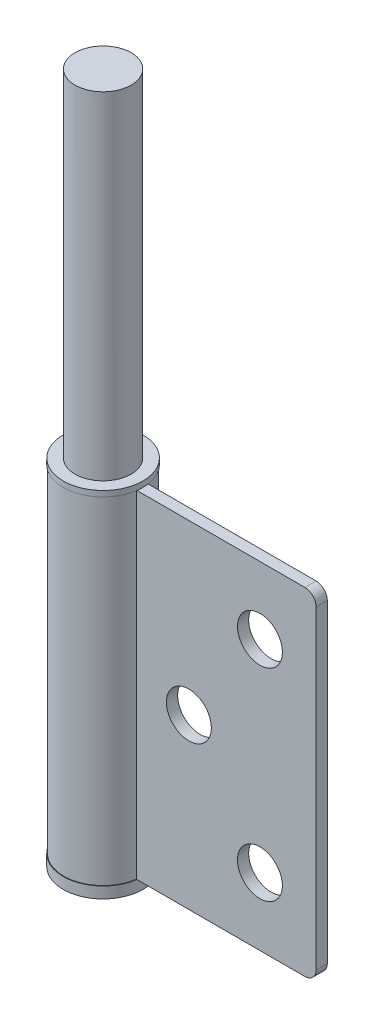
ISO-10303-21;
HEADER;
FILE_DESCRIPTION(('STEP AP214'),'2;1');
FILE_NAME('part.step','',(''),(''),'','','');
FILE_SCHEMA(('AUTOMOTIVE_DESIGN { 1 0 10303 214 1 1 1 1 }'));
ENDSEC;
DATA;
#1=APPLICATION_CONTEXT('core data for automotive mechanical design processes');
#2=APPLICATION_PROTOCOL_DEFINITION('international standard','automotive_design',2000,#1);
#3=PRODUCT_CONTEXT('',#1,'mechanical');
#4=PRODUCT('Part','Part','',(#3));
#5=PRODUCT_RELATED_PRODUCT_CATEGORY('part','',(#4));
#6=PRODUCT_DEFINITION_FORMATION('','',#4);
#7=PRODUCT_DEFINITION_CONTEXT('part definition',#1,'design');
#8=PRODUCT_DEFINITION('design','',#6,#7);
#9=PRODUCT_DEFINITION_SHAPE('','',#8);
#10=(LENGTH_UNIT() NAMED_UNIT(*) SI_UNIT(.MILLI.,.METRE.));
#11=(NAMED_UNIT(*) PLANE_ANGLE_UNIT() SI_UNIT($,.RADIAN.));
#12=(NAMED_UNIT(*) SI_UNIT($,.STERADIAN.) SOLID_ANGLE_UNIT());
#13=UNCERTAINTY_MEASURE_WITH_UNIT(LENGTH_MEASURE(1.E-05),#10,'distance_accuracy_value','');
#14=(GEOMETRIC_REPRESENTATION_CONTEXT(3) GLOBAL_UNCERTAINTY_ASSIGNED_CONTEXT((#13)) GLOBAL_UNIT_ASSIGNED_CONTEXT((#10,
#11,#12)) REPRESENTATION_CONTEXT('',''));
#15=CARTESIAN_POINT('',(0.,0.,0.));
#16=DIRECTION('',(0.,0.,1.));
#17=DIRECTION('',(1.,0.,0.));
#18=AXIS2_PLACEMENT_3D('',#15,#16,#17);
#19=CARTESIAN_POINT('',(0.,30.,0.));
#20=DIRECTION('',(0.,1.,0.));
#21=DIRECTION('',(0.,0.,1.));
#22=AXIS2_PLACEMENT_3D('',#19,#20,#21);
#23=PLANE('',#22);
#24=DIRECTION('',(-1.,0.,0.));
#25=VECTOR('',#24,1.);
#26=CARTESIAN_POINT('',(19.4641016151378,30.,-0.500000000000001));
#27=LINE('',#26,#25);
#28=CARTESIAN_POINT('',(18.4641016151378,30.,-0.500000000000001));
#29=VERTEX_POINT('',#28);
#30=CARTESIAN_POINT('',(3.514612354158,30.,-0.499999999999999));
#31=VERTEX_POINT('',#30);
#32=EDGE_CURVE('E119',#29,#31,#27,.T.);
#33=ORIENTED_EDGE('',*,*,#32,.T.);
#34=CARTESIAN_POINT('',(0.,30.,0.));
#35=DIRECTION('',(0.,1.,0.));
#36=DIRECTION('',(0.,0.,1.));
#37=AXIS2_PLACEMENT_3D('',#34,#35,#36);
#38=CIRCLE('',#37,3.55);
#39=CARTESIAN_POINT('',(3.514612354158,30.,0.500000000000001));
#40=VERTEX_POINT('',#39);
#41=EDGE_CURVE('E50',#40,#31,#38,.T.);
#42=ORIENTED_EDGE('',*,*,#41,.F.);
#43=DIRECTION('',(1.,0.,0.));
#44=VECTOR('',#43,1.);
#45=CARTESIAN_POINT('',(19.4641016151378,30.,0.499999999999999));
#46=LINE('',#45,#44);
#47=CARTESIAN_POINT('',(18.4641016151378,30.,0.499999999999999));
#48=VERTEX_POINT('',#47);
#49=EDGE_CURVE('E111',#40,#48,#46,.T.);
#50=ORIENTED_EDGE('',*,*,#49,.T.);
#51=DIRECTION('',(0.,0.,-1.));
#52=VECTOR('',#51,1.);
#53=CARTESIAN_POINT('',(18.4641016151378,30.,-0.500000000000001));
#54=LINE('',#53,#52);
#55=EDGE_CURVE('E176',#48,#29,#54,.T.);
#56=ORIENTED_EDGE('',*,*,#55,.T.);
#57=EDGE_LOOP('',(#33,#42,#50,#56));
#58=FACE_BOUND('',#57,.T.);
#59=ADVANCED_FACE('F35',(#58),#23,.T.);
#60=CARTESIAN_POINT('',(0.,0.,0.));
#61=DIRECTION('',(0.,1.,0.));
#62=DIRECTION('',(0.,0.,1.));
#63=AXIS2_PLACEMENT_3D('',#60,#61,#62);
#64=PLANE('',#63);
#65=CARTESIAN_POINT('',(0.,0.,0.));
#66=DIRECTION('',(0.,-1.,0.));
#67=DIRECTION('',(0.,0.,-1.));
#68=AXIS2_PLACEMENT_3D('',#65,#66,#67);
#69=CIRCLE('',#68,3.55);
#70=CARTESIAN_POINT('',(3.51461235415799,0.,-0.499999999999999));
#71=VERTEX_POINT('',#70);
#72=CARTESIAN_POINT('',(3.51461235415799,0.,0.500000000000001));
#73=VERTEX_POINT('',#72);
#74=EDGE_CURVE('E129',#71,#73,#69,.T.);
#75=ORIENTED_EDGE('',*,*,#74,.F.);
#76=DIRECTION('',(-1.,0.,0.));
#77=VECTOR('',#76,1.);
#78=CARTESIAN_POINT('',(19.4641016151378,0.,-0.500000000000001));
#79=LINE('',#78,#77);
#80=CARTESIAN_POINT('',(18.4641016151378,0.,-0.500000000000001));
#81=VERTEX_POINT('',#80);
#82=EDGE_CURVE('E112',#81,#71,#79,.T.);
#83=ORIENTED_EDGE('',*,*,#82,.F.);
#84=DIRECTION('',(0.,0.,-1.));
#85=VECTOR('',#84,1.);
#86=CARTESIAN_POINT('',(18.4641016151378,0.,0.));
#87=LINE('',#86,#85);
#88=CARTESIAN_POINT('',(18.4641016151378,0.,0.499999999999999));
#89=VERTEX_POINT('',#88);
#90=EDGE_CURVE('E43',#81,#89,#87,.F.);
#91=ORIENTED_EDGE('',*,*,#90,.T.);
#92=DIRECTION('',(1.,0.,0.));
#93=VECTOR('',#92,1.);
#94=CARTESIAN_POINT('',(19.4641016151378,0.,0.499999999999999));
#95=LINE('',#94,#93);
#96=EDGE_CURVE('E165',#73,#89,#95,.T.);
#97=ORIENTED_EDGE('',*,*,#96,.F.);
#98=EDGE_LOOP('',(#75,#83,#91,#97));
#99=FACE_BOUND('',#98,.T.);
#100=ADVANCED_FACE('F199',(#99),#64,.F.);
#101=CARTESIAN_POINT('',(0.,30.,0.));
#102=DIRECTION('',(0.,-1.,0.));
#103=DIRECTION('',(0.,0.,-1.));
#104=AXIS2_PLACEMENT_3D('',#101,#102,#103);
#105=CYLINDRICAL_SURFACE('',#104,3.5);
#106=CARTESIAN_POINT('',(0.,0.,0.));
#107=DIRECTION('',(0.,1.,0.));
#108=DIRECTION('',(0.,0.,1.));
#109=AXIS2_PLACEMENT_3D('',#106,#107,#108);
#110=CIRCLE('',#109,3.5);
#111=CARTESIAN_POINT('',(3.46410161513775,0.,-0.499999999999999));
#112=VERTEX_POINT('',#111);
#113=CARTESIAN_POINT('',(3.46410161513776,0.,0.500000000000001));
#114=VERTEX_POINT('',#113);
#115=EDGE_CURVE('E150',#112,#114,#110,.T.);
#116=ORIENTED_EDGE('',*,*,#115,.T.);
#117=DIRECTION('',(0.,-1.,0.));
#118=VECTOR('',#117,1.);
#119=CARTESIAN_POINT('',(3.46410161513776,30.,0.500000000000001));
#120=LINE('',#119,#118);
#121=CARTESIAN_POINT('',(3.46410161513776,30.,0.500000000000001));
#122=VERTEX_POINT('',#121);
#123=EDGE_CURVE('E108',#122,#114,#120,.T.);
#124=ORIENTED_EDGE('',*,*,#123,.F.);
#125=CARTESIAN_POINT('',(0.,30.,0.));
#126=DIRECTION('',(0.,1.,0.));
#127=DIRECTION('',(0.,0.,1.));
#128=AXIS2_PLACEMENT_3D('',#125,#126,#127);
#129=CIRCLE('',#128,3.5);
#130=CARTESIAN_POINT('',(3.46410161513776,30.,-0.499999999999999));
#131=VERTEX_POINT('',#130);
#132=EDGE_CURVE('E103',#131,#122,#129,.T.);
#133=ORIENTED_EDGE('',*,*,#132,.F.);
#134=DIRECTION('',(0.,-1.,0.));
#135=VECTOR('',#134,1.);
#136=CARTESIAN_POINT('',(3.46410161513775,30.,-0.499999999999999));
#137=LINE('',#136,#135);
#138=EDGE_CURVE('E106',#131,#112,#137,.T.);
#139=ORIENTED_EDGE('',*,*,#138,.T.);
#140=EDGE_LOOP('',(#116,#124,#133,#139));
#141=FACE_BOUND('',#140,.T.);
#142=ADVANCED_FACE('F105',(#141),#105,.T.);
#143=CARTESIAN_POINT('',(19.4641016151378,30.,0.499999999999999));
#144=DIRECTION('',(0.,0.,-1.));
#145=DIRECTION('',(-1.,0.,0.));
#146=AXIS2_PLACEMENT_3D('',#143,#144,#145);
#147=PLANE('',#146);
#148=CARTESIAN_POINT('',(14.4641016151377,24.,0.500000000000001));
#149=DIRECTION('',(0.,0.,1.));
#150=DIRECTION('',(1.,0.,0.));
#151=AXIS2_PLACEMENT_3D('',#148,#149,#150);
#152=CIRCLE('',#151,2.);
#153=CARTESIAN_POINT('',(16.4641016151377,24.,0.500000000000001));
#154=VERTEX_POINT('',#153);
#155=EDGE_CURVE('E143',#154,#154,#152,.T.);
#156=ORIENTED_EDGE('',*,*,#155,.F.);
#157=EDGE_LOOP('',(#156));
#158=FACE_BOUND('',#157,.T.);
#159=CARTESIAN_POINT('',(8.13954629480099,15.,0.500000000000001));
#160=DIRECTION('',(0.,0.,1.));
#161=DIRECTION('',(1.,0.,0.));
#162=AXIS2_PLACEMENT_3D('',#159,#160,#161);
#163=CIRCLE('',#162,2.);
#164=CARTESIAN_POINT('',(10.139546294801,15.,0.500000000000001));
#165=VERTEX_POINT('',#164);
#166=EDGE_CURVE('E151',#165,#165,#163,.T.);
#167=ORIENTED_EDGE('',*,*,#166,.F.);
#168=EDGE_LOOP('',(#167));
#169=FACE_BOUND('',#168,.T.);
#170=CARTESIAN_POINT('',(14.4641016151378,6.,0.500000000000001));
#171=DIRECTION('',(0.,0.,1.));
#172=DIRECTION('',(-1.,0.,0.));
#173=AXIS2_PLACEMENT_3D('',#170,#171,#172);
#174=CIRCLE('',#173,2.);
#175=CARTESIAN_POINT('',(12.4641016151377,6.,0.500000000000001));
#176=VERTEX_POINT('',#175);
#177=EDGE_CURVE('E142',#176,#176,#174,.T.);
#178=ORIENTED_EDGE('',*,*,#177,.F.);
#179=EDGE_LOOP('',(#178));
#180=FACE_BOUND('',#179,.T.);
#181=DIRECTION('',(0.,-1.,0.));
#182=VECTOR('',#181,1.);
#183=CARTESIAN_POINT('',(19.4641016151378,30.,0.499999999999999));
#184=LINE('',#183,#182);
#185=CARTESIAN_POINT('',(19.4641016151378,29.,0.499999999999999));
#186=VERTEX_POINT('',#185);
#187=CARTESIAN_POINT('',(19.4641016151378,1.,0.499999999999999));
#188=VERTEX_POINT('',#187);
#189=EDGE_CURVE('E172',#186,#188,#184,.T.);
#190=ORIENTED_EDGE('',*,*,#189,.F.);
#191=CARTESIAN_POINT('',(18.4641016151378,29.,0.499999999999999));
#192=DIRECTION('',(0.,0.,-1.));
#193=DIRECTION('',(-1.,0.,0.));
#194=AXIS2_PLACEMENT_3D('',#191,#192,#193);
#195=CIRCLE('',#194,1.);
#196=EDGE_CURVE('E190',#186,#48,#195,.F.);
#197=ORIENTED_EDGE('',*,*,#196,.T.);
#198=ORIENTED_EDGE('',*,*,#49,.F.);
#199=EDGE_CURVE('E161',#122,#40,#46,.T.);
#200=ORIENTED_EDGE('',*,*,#199,.F.);
#201=ORIENTED_EDGE('',*,*,#123,.T.);
#202=EDGE_CURVE('E166',#114,#73,#95,.T.);
#203=ORIENTED_EDGE('',*,*,#202,.T.);
#204=ORIENTED_EDGE('',*,*,#96,.T.);
#205=CARTESIAN_POINT('',(18.4641016151378,1.,0.499999999999999));
#206=DIRECTION('',(0.,0.,-1.));
#207=DIRECTION('',(-1.,0.,0.));
#208=AXIS2_PLACEMENT_3D('',#205,#206,#207);
#209=CIRCLE('',#208,1.);
#210=EDGE_CURVE('E188',#89,#188,#209,.F.);
#211=ORIENTED_EDGE('',*,*,#210,.T.);
#212=EDGE_LOOP('',(#190,#197,#198,#200,#201,#203,#204,#211));
#213=FACE_BOUND('',#212,.T.);
#214=ADVANCED_FACE('F204',(#158,#169,#180,#213),#147,.F.);
#215=CARTESIAN_POINT('',(19.4641016151378,30.,0.499999999999999));
#216=DIRECTION('',(-1.,0.,0.));
#217=DIRECTION('',(0.,0.,1.));
#218=AXIS2_PLACEMENT_3D('',#215,#216,#217);
#219=PLANE('',#218);
#220=DIRECTION('',(0.,-1.,0.));
#221=VECTOR('',#220,1.);
#222=CARTESIAN_POINT('',(19.4641016151378,30.,-0.500000000000001));
#223=LINE('',#222,#221);
#224=CARTESIAN_POINT('',(19.4641016151378,29.,-0.500000000000001));
#225=VERTEX_POINT('',#224);
#226=CARTESIAN_POINT('',(19.4641016151378,1.,-0.500000000000001));
#227=VERTEX_POINT('',#226);
#228=EDGE_CURVE('E118',#225,#227,#223,.T.);
#229=ORIENTED_EDGE('',*,*,#228,.F.);
#230=DIRECTION('',(0.,0.,-1.));
#231=VECTOR('',#230,1.);
#232=CARTESIAN_POINT('',(19.4641016151378,29.,0.499999999999999));
#233=LINE('',#232,#231);
#234=EDGE_CURVE('E186',#225,#186,#233,.F.);
#235=ORIENTED_EDGE('',*,*,#234,.T.);
#236=ORIENTED_EDGE('',*,*,#189,.T.);
#237=DIRECTION('',(0.,0.,-1.));
#238=VECTOR('',#237,1.);
#239=CARTESIAN_POINT('',(19.4641016151378,1.,0.499999999999999));
#240=LINE('',#239,#238);
#241=EDGE_CURVE('E183',#188,#227,#240,.T.);
#242=ORIENTED_EDGE('',*,*,#241,.T.);
#243=EDGE_LOOP('',(#229,#235,#236,#242));
#244=FACE_BOUND('',#243,.T.);
#245=ADVANCED_FACE('F208',(#244),#219,.F.);
#246=CARTESIAN_POINT('',(19.4641016151378,30.,-0.500000000000001));
#247=DIRECTION('',(0.,0.,1.));
#248=DIRECTION('',(1.,0.,0.));
#249=AXIS2_PLACEMENT_3D('',#246,#247,#248);
#250=PLANE('',#249);
#251=CARTESIAN_POINT('',(14.4641016151377,24.,-0.5));
#252=DIRECTION('',(0.,0.,1.));
#253=DIRECTION('',(1.,0.,0.));
#254=AXIS2_PLACEMENT_3D('',#251,#252,#253);
#255=CIRCLE('',#254,2.);
#256=CARTESIAN_POINT('',(16.4641016151377,24.,-0.500000000000001));
#257=VERTEX_POINT('',#256);
#258=EDGE_CURVE('E146',#257,#257,#255,.F.);
#259=ORIENTED_EDGE('',*,*,#258,.F.);
#260=EDGE_LOOP('',(#259));
#261=FACE_BOUND('',#260,.T.);
#262=CARTESIAN_POINT('',(8.13954629480099,15.,-0.5));
#263=DIRECTION('',(0.,0.,1.));
#264=DIRECTION('',(1.,0.,0.));
#265=AXIS2_PLACEMENT_3D('',#262,#263,#264);
#266=CIRCLE('',#265,2.);
#267=CARTESIAN_POINT('',(10.139546294801,15.,-0.5));
#268=VERTEX_POINT('',#267);
#269=EDGE_CURVE('E147',#268,#268,#266,.F.);
#270=ORIENTED_EDGE('',*,*,#269,.F.);
#271=EDGE_LOOP('',(#270));
#272=FACE_BOUND('',#271,.T.);
#273=CARTESIAN_POINT('',(14.4641016151378,6.,-0.5));
#274=DIRECTION('',(0.,0.,1.));
#275=DIRECTION('',(1.,0.,0.));
#276=AXIS2_PLACEMENT_3D('',#273,#274,#275);
#277=CIRCLE('',#276,2.);
#278=CARTESIAN_POINT('',(16.4641016151377,6.,-0.500000000000001));
#279=VERTEX_POINT('',#278);
#280=EDGE_CURVE('E154',#279,#279,#277,.F.);
#281=ORIENTED_EDGE('',*,*,#280,.F.);
#282=EDGE_LOOP('',(#281));
#283=FACE_BOUND('',#282,.T.);
#284=ORIENTED_EDGE('',*,*,#32,.F.);
#285=CARTESIAN_POINT('',(18.4641016151378,29.,-0.500000000000001));
#286=DIRECTION('',(0.,0.,1.));
#287=DIRECTION('',(1.,0.,0.));
#288=AXIS2_PLACEMENT_3D('',#285,#286,#287);
#289=CIRCLE('',#288,1.);
#290=EDGE_CURVE('E181',#29,#225,#289,.F.);
#291=ORIENTED_EDGE('',*,*,#290,.T.);
#292=ORIENTED_EDGE('',*,*,#228,.T.);
#293=CARTESIAN_POINT('',(18.4641016151378,1.,-0.500000000000001));
#294=DIRECTION('',(0.,0.,1.));
#295=DIRECTION('',(1.,0.,0.));
#296=AXIS2_PLACEMENT_3D('',#293,#294,#295);
#297=CIRCLE('',#296,1.);
#298=EDGE_CURVE('E179',#227,#81,#297,.F.);
#299=ORIENTED_EDGE('',*,*,#298,.T.);
#300=ORIENTED_EDGE('',*,*,#82,.T.);
#301=EDGE_CURVE('E117',#71,#112,#79,.T.);
#302=ORIENTED_EDGE('',*,*,#301,.T.);
#303=ORIENTED_EDGE('',*,*,#138,.F.);
#304=DIRECTION('',(-1.,0.,0.));
#305=VECTOR('',#304,1.);
#306=CARTESIAN_POINT('',(19.4641016151378,30.,-0.500000000000001));
#307=LINE('',#306,#305);
#308=EDGE_CURVE('E58',#31,#131,#307,.T.);
#309=ORIENTED_EDGE('',*,*,#308,.F.);
#310=EDGE_LOOP('',(#284,#291,#292,#299,#300,#302,#303,#309));
#311=FACE_BOUND('',#310,.T.);
#312=ADVANCED_FACE('F115',(#261,#272,#283,#311),#250,.F.);
#313=CARTESIAN_POINT('',(14.4641016151378,6.,-3.501));
#314=DIRECTION('',(0.,0.,1.));
#315=DIRECTION('',(1.,0.,0.));
#316=AXIS2_PLACEMENT_3D('',#313,#314,#315);
#317=CYLINDRICAL_SURFACE('',#316,2.);
#318=ORIENTED_EDGE('',*,*,#177,.T.);
#319=EDGE_LOOP('',(#318));
#320=FACE_BOUND('',#319,.T.);
#321=ORIENTED_EDGE('',*,*,#280,.T.);
#322=EDGE_LOOP('',(#321));
#323=FACE_BOUND('',#322,.T.);
#324=ADVANCED_FACE('F239',(#320,#323),#317,.F.);
#325=CARTESIAN_POINT('',(8.13954629480099,15.,-3.501));
#326=DIRECTION('',(0.,0.,1.));
#327=DIRECTION('',(1.,0.,0.));
#328=AXIS2_PLACEMENT_3D('',#325,#326,#327);
#329=CYLINDRICAL_SURFACE('',#328,2.);
#330=ORIENTED_EDGE('',*,*,#166,.T.);
#331=EDGE_LOOP('',(#330));
#332=FACE_BOUND('',#331,.T.);
#333=ORIENTED_EDGE('',*,*,#269,.T.);
#334=EDGE_LOOP('',(#333));
#335=FACE_BOUND('',#334,.T.);
#336=ADVANCED_FACE('F258',(#332,#335),#329,.F.);
#337=CARTESIAN_POINT('',(14.4641016151377,24.,-3.501));
#338=DIRECTION('',(0.,0.,1.));
#339=DIRECTION('',(1.,0.,0.));
#340=AXIS2_PLACEMENT_3D('',#337,#338,#339);
#341=CYLINDRICAL_SURFACE('',#340,2.);
#342=ORIENTED_EDGE('',*,*,#155,.T.);
#343=EDGE_LOOP('',(#342));
#344=FACE_BOUND('',#343,.T.);
#345=ORIENTED_EDGE('',*,*,#258,.T.);
#346=EDGE_LOOP('',(#345));
#347=FACE_BOUND('',#346,.T.);
#348=ADVANCED_FACE('F252',(#344,#347),#341,.F.);
#349=CARTESIAN_POINT('',(18.4641016151378,29.,0.));
#350=DIRECTION('',(0.,0.,1.));
#351=DIRECTION('',(1.,0.,0.));
#352=AXIS2_PLACEMENT_3D('',#349,#350,#351);
#353=CYLINDRICAL_SURFACE('',#352,1.);
#354=ORIENTED_EDGE('',*,*,#196,.F.);
#355=ORIENTED_EDGE('',*,*,#234,.F.);
#356=ORIENTED_EDGE('',*,*,#290,.F.);
#357=ORIENTED_EDGE('',*,*,#55,.F.);
#358=EDGE_LOOP('',(#354,#355,#356,#357));
#359=FACE_BOUND('',#358,.T.);
#360=ADVANCED_FACE('F211',(#359),#353,.T.);
#361=CARTESIAN_POINT('',(18.4641016151378,1.,0.499999999999999));
#362=DIRECTION('',(0.,0.,-1.));
#363=DIRECTION('',(-1.,0.,0.));
#364=AXIS2_PLACEMENT_3D('',#361,#362,#363);
#365=CYLINDRICAL_SURFACE('',#364,1.);
#366=ORIENTED_EDGE('',*,*,#210,.F.);
#367=ORIENTED_EDGE('',*,*,#90,.F.);
#368=ORIENTED_EDGE('',*,*,#298,.F.);
#369=ORIENTED_EDGE('',*,*,#241,.F.);
#370=EDGE_LOOP('',(#366,#367,#368,#369));
#371=FACE_BOUND('',#370,.T.);
#372=ADVANCED_FACE('F37',(#371),#365,.T.);
#373=CARTESIAN_POINT('',(0.,0.,0.));
#374=DIRECTION('',(0.,-1.,0.));
#375=DIRECTION('',(0.,0.,-1.));
#376=AXIS2_PLACEMENT_3D('',#373,#374,#375);
#377=PLANE('',#376);
#378=EDGE_CURVE('E125',#73,#71,#69,.T.);
#379=ORIENTED_EDGE('',*,*,#378,.F.);
#380=ORIENTED_EDGE('',*,*,#202,.F.);
#381=ORIENTED_EDGE('',*,*,#115,.F.);
#382=ORIENTED_EDGE('',*,*,#301,.F.);
#383=EDGE_LOOP('',(#379,#380,#381,#382));
#384=FACE_BOUND('',#383,.T.);
#385=ADVANCED_FACE('F257',(#384),#377,.F.);
#386=CARTESIAN_POINT('',(0.,-1.,0.));
#387=DIRECTION('',(0.,1.,0.));
#388=DIRECTION('',(0.,0.,1.));
#389=AXIS2_PLACEMENT_3D('',#386,#387,#388);
#390=CYLINDRICAL_SURFACE('',#389,3.55);
#391=CARTESIAN_POINT('',(0.,-1.,0.));
#392=DIRECTION('',(0.,-1.,0.));
#393=DIRECTION('',(0.,0.,-1.));
#394=AXIS2_PLACEMENT_3D('',#391,#392,#393);
#395=CIRCLE('',#394,3.55);
#396=CARTESIAN_POINT('',(0.,-1.,-3.55));
#397=VERTEX_POINT('',#396);
#398=EDGE_CURVE('E135',#397,#397,#395,.T.);
#399=ORIENTED_EDGE('',*,*,#398,.F.);
#400=EDGE_LOOP('',(#399));
#401=FACE_BOUND('',#400,.T.);
#402=ORIENTED_EDGE('',*,*,#74,.T.);
#403=ORIENTED_EDGE('',*,*,#378,.T.);
#404=EDGE_LOOP('',(#402,#403));
#405=FACE_BOUND('',#404,.T.);
#406=ADVANCED_FACE('F270',(#401,#405),#390,.T.);
#407=CARTESIAN_POINT('',(0.,-1.,0.));
#408=DIRECTION('',(0.,-1.,0.));
#409=DIRECTION('',(0.,0.,-1.));
#410=AXIS2_PLACEMENT_3D('',#407,#408,#409);
#411=PLANE('',#410);
#412=ORIENTED_EDGE('',*,*,#398,.T.);
#413=EDGE_LOOP('',(#412));
#414=FACE_BOUND('',#413,.T.);
#415=ADVANCED_FACE('F273',(#414),#411,.T.);
#416=CARTESIAN_POINT('',(0.,30.,0.));
#417=DIRECTION('',(0.,1.,0.));
#418=DIRECTION('',(0.,0.,1.));
#419=AXIS2_PLACEMENT_3D('',#416,#417,#418);
#420=PLANE('',#419);
#421=ORIENTED_EDGE('',*,*,#132,.T.);
#422=ORIENTED_EDGE('',*,*,#199,.T.);
#423=EDGE_CURVE('E124',#31,#40,#38,.T.);
#424=ORIENTED_EDGE('',*,*,#423,.F.);
#425=ORIENTED_EDGE('',*,*,#308,.T.);
#426=EDGE_LOOP('',(#421,#422,#424,#425));
#427=FACE_BOUND('',#426,.T.);
#428=ADVANCED_FACE('F122',(#427),#420,.F.);
#429=CARTESIAN_POINT('',(0.,30.5,0.));
#430=DIRECTION('',(0.,1.,0.));
#431=DIRECTION('',(0.,0.,1.));
#432=AXIS2_PLACEMENT_3D('',#429,#430,#431);
#433=PLANE('',#432);
#434=CARTESIAN_POINT('',(0.,30.5,0.));
#435=DIRECTION('',(0.,1.,0.));
#436=DIRECTION('',(0.,0.,1.));
#437=AXIS2_PLACEMENT_3D('',#434,#435,#436);
#438=CIRCLE('',#437,3.55);
#439=CARTESIAN_POINT('',(0.,30.5,3.55));
#440=VERTEX_POINT('',#439);
#441=EDGE_CURVE('E126',#440,#440,#438,.T.);
#442=ORIENTED_EDGE('',*,*,#441,.T.);
#443=EDGE_LOOP('',(#442));
#444=FACE_BOUND('',#443,.T.);
#445=CARTESIAN_POINT('',(0.,30.5,0.));
#446=DIRECTION('',(0.,1.,0.));
#447=DIRECTION('',(0.,0.,1.));
#448=AXIS2_PLACEMENT_3D('',#445,#446,#447);
#449=CIRCLE('',#448,2.5);
#450=CARTESIAN_POINT('',(0.,30.5,2.5));
#451=VERTEX_POINT('',#450);
#452=EDGE_CURVE('E11',#451,#451,#449,.F.);
#453=ORIENTED_EDGE('',*,*,#452,.T.);
#454=EDGE_LOOP('',(#453));
#455=FACE_BOUND('',#454,.T.);
#456=ADVANCED_FACE('F217',(#444,#455),#433,.T.);
#457=CARTESIAN_POINT('',(0.,30.5,0.));
#458=DIRECTION('',(0.,-1.,0.));
#459=DIRECTION('',(0.,0.,-1.));
#460=AXIS2_PLACEMENT_3D('',#457,#458,#459);
#461=CYLINDRICAL_SURFACE('',#460,3.55);
#462=ORIENTED_EDGE('',*,*,#441,.F.);
#463=EDGE_LOOP('',(#462));
#464=FACE_BOUND('',#463,.T.);
#465=ORIENTED_EDGE('',*,*,#41,.T.);
#466=ORIENTED_EDGE('',*,*,#423,.T.);
#467=EDGE_LOOP('',(#465,#466));
#468=FACE_BOUND('',#467,.T.);
#469=ADVANCED_FACE('F214',(#464,#468),#461,.T.);
#470=CARTESIAN_POINT('',(0.,60.5,0.));
#471=DIRECTION('',(0.,-1.,0.));
#472=DIRECTION('',(0.,0.,-1.));
#473=AXIS2_PLACEMENT_3D('',#470,#471,#472);
#474=PLANE('',#473);
#475=CARTESIAN_POINT('',(0.,60.5,0.));
#476=DIRECTION('',(0.,-1.,0.));
#477=DIRECTION('',(0.,0.,-1.));
#478=AXIS2_PLACEMENT_3D('',#475,#476,#477);
#479=CIRCLE('',#478,2.5);
#480=CARTESIAN_POINT('',(0.,60.5,-2.5));
#481=VERTEX_POINT('',#480);
#482=EDGE_CURVE('E137',#481,#481,#479,.T.);
#483=ORIENTED_EDGE('',*,*,#482,.F.);
#484=EDGE_LOOP('',(#483));
#485=FACE_BOUND('',#484,.T.);
#486=ADVANCED_FACE('F216',(#485),#474,.F.);
#487=CARTESIAN_POINT('',(0.,60.5,0.));
#488=DIRECTION('',(0.,-1.,0.));
#489=DIRECTION('',(0.,0.,-1.));
#490=AXIS2_PLACEMENT_3D('',#487,#488,#489);
#491=CYLINDRICAL_SURFACE('',#490,2.5);
#492=ORIENTED_EDGE('',*,*,#452,.F.);
#493=EDGE_LOOP('',(#492));
#494=FACE_BOUND('',#493,.T.);
#495=ORIENTED_EDGE('',*,*,#482,.T.);
#496=EDGE_LOOP('',(#495));
#497=FACE_BOUND('',#496,.T.);
#498=ADVANCED_FACE('F224',(#494,#497),#491,.T.);
#499=CLOSED_SHELL('',(#59,#100,#142,#214,#245,#312,#324,#336,#348,#360,#372,#385,#406,#415,#428,
#456,#469,#486,#498));
#500=MANIFOLD_SOLID_BREP('B2',#499);
#501=ADVANCED_BREP_SHAPE_REPRESENTATION('',(#18,#500),#14);
#502=SHAPE_DEFINITION_REPRESENTATION(#9,#501);
ENDSEC;
END-ISO-10303-21;
